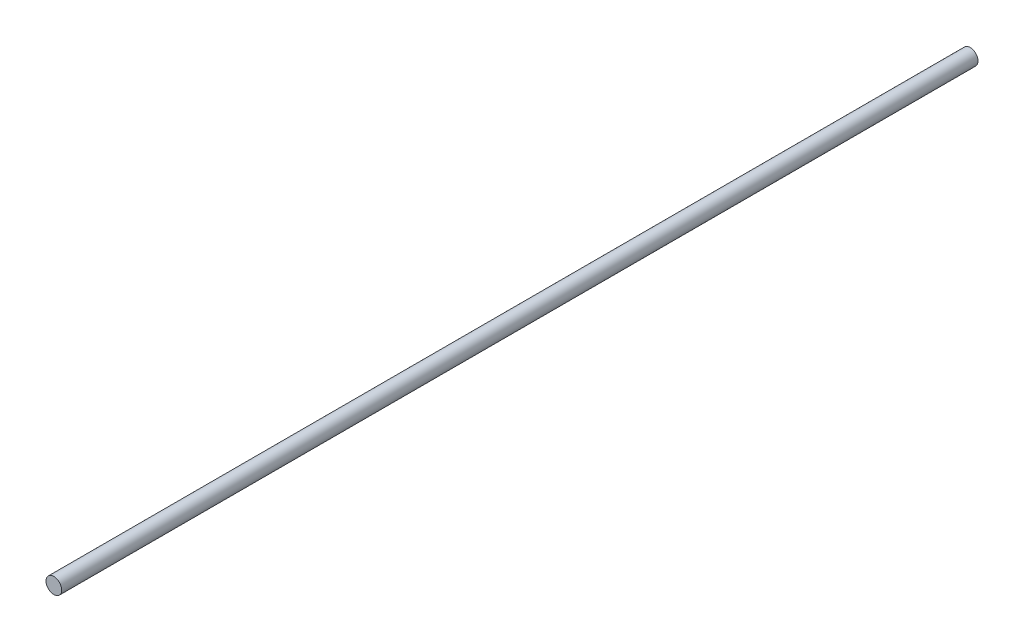
ISO-10303-21;
HEADER;
FILE_DESCRIPTION(('STEP AP214'),'2;1');
FILE_NAME('part.step','',(''),(''),'','','');
FILE_SCHEMA(('AUTOMOTIVE_DESIGN { 1 0 10303 214 1 1 1 1 }'));
ENDSEC;
DATA;
#1=APPLICATION_CONTEXT('core data for automotive mechanical design processes');
#2=APPLICATION_PROTOCOL_DEFINITION('international standard','automotive_design',2000,#1);
#3=PRODUCT_CONTEXT('',#1,'mechanical');
#4=PRODUCT('Part','Part','',(#3));
#5=PRODUCT_RELATED_PRODUCT_CATEGORY('part','',(#4));
#6=PRODUCT_DEFINITION_FORMATION('','',#4);
#7=PRODUCT_DEFINITION_CONTEXT('part definition',#1,'design');
#8=PRODUCT_DEFINITION('design','',#6,#7);
#9=PRODUCT_DEFINITION_SHAPE('','',#8);
#10=(LENGTH_UNIT() NAMED_UNIT(*) SI_UNIT(.MILLI.,.METRE.));
#11=(NAMED_UNIT(*) PLANE_ANGLE_UNIT() SI_UNIT($,.RADIAN.));
#12=(NAMED_UNIT(*) SI_UNIT($,.STERADIAN.) SOLID_ANGLE_UNIT());
#13=UNCERTAINTY_MEASURE_WITH_UNIT(LENGTH_MEASURE(1.E-05),#10,'distance_accuracy_value','');
#14=(GEOMETRIC_REPRESENTATION_CONTEXT(3) GLOBAL_UNCERTAINTY_ASSIGNED_CONTEXT((#13)) GLOBAL_UNIT_ASSIGNED_CONTEXT((#10,
#11,#12)) REPRESENTATION_CONTEXT('',''));
#15=CARTESIAN_POINT('',(0.,0.,0.));
#16=DIRECTION('',(0.,0.,1.));
#17=DIRECTION('',(1.,0.,0.));
#18=AXIS2_PLACEMENT_3D('',#15,#16,#17);
#19=CARTESIAN_POINT('',(0.,0.,370.84));
#20=DIRECTION('',(0.,0.,-1.));
#21=DIRECTION('',(-1.,0.,0.));
#22=AXIS2_PLACEMENT_3D('',#19,#20,#21);
#23=CYLINDRICAL_SURFACE('',#22,3.175);
#24=CARTESIAN_POINT('',(0.,0.,370.84));
#25=DIRECTION('',(0.,0.,1.));
#26=DIRECTION('',(1.,0.,0.));
#27=AXIS2_PLACEMENT_3D('',#24,#25,#26);
#28=CIRCLE('',#27,3.175);
#29=CARTESIAN_POINT('',(-3.175,0.,370.84));
#30=VERTEX_POINT('',#29);
#31=EDGE_CURVE('E10',#30,#30,#28,.T.);
#32=CARTESIAN_POINT('',(0.,0.,0.));
#33=DIRECTION('',(0.,0.,1.));
#34=DIRECTION('',(1.,0.,0.));
#35=AXIS2_PLACEMENT_3D('',#32,#33,#34);
#36=CIRCLE('',#35,3.175);
#37=CARTESIAN_POINT('',(-3.175,0.,0.));
#38=VERTEX_POINT('',#37);
#39=EDGE_CURVE('E40',#38,#38,#36,.T.);
#40=CARTESIAN_POINT('',(-3.175,0.,370.84));
#41=CARTESIAN_POINT('',(-3.175,0.,366.977083333333));
#42=CARTESIAN_POINT('',(-3.175,0.,363.114166666667));
#43=CARTESIAN_POINT('',(-3.175,0.,355.388333333333));
#44=CARTESIAN_POINT('',(-3.175,0.,351.525416666667));
#45=CARTESIAN_POINT('',(-3.175,0.,343.799583333333));
#46=CARTESIAN_POINT('',(-3.175,0.,339.936666666667));
#47=CARTESIAN_POINT('',(-3.175,0.,332.210833333333));
#48=CARTESIAN_POINT('',(-3.175,0.,328.347916666667));
#49=CARTESIAN_POINT('',(-3.175,0.,320.622083333333));
#50=CARTESIAN_POINT('',(-3.175,0.,316.759166666667));
#51=CARTESIAN_POINT('',(-3.175,0.,309.033333333333));
#52=CARTESIAN_POINT('',(-3.175,0.,305.170416666667));
#53=CARTESIAN_POINT('',(-3.175,0.,297.444583333333));
#54=CARTESIAN_POINT('',(-3.175,0.,293.581666666667));
#55=CARTESIAN_POINT('',(-3.175,0.,285.855833333333));
#56=CARTESIAN_POINT('',(-3.175,0.,281.992916666667));
#57=CARTESIAN_POINT('',(-3.175,0.,274.267083333333));
#58=CARTESIAN_POINT('',(-3.175,0.,270.404166666667));
#59=CARTESIAN_POINT('',(-3.175,0.,262.678333333333));
#60=CARTESIAN_POINT('',(-3.175,0.,258.815416666667));
#61=CARTESIAN_POINT('',(-3.175,0.,251.089583333333));
#62=CARTESIAN_POINT('',(-3.175,0.,247.226666666667));
#63=CARTESIAN_POINT('',(-3.175,0.,239.500833333333));
#64=CARTESIAN_POINT('',(-3.175,0.,235.637916666667));
#65=CARTESIAN_POINT('',(-3.175,0.,227.912083333333));
#66=CARTESIAN_POINT('',(-3.175,0.,224.049166666667));
#67=CARTESIAN_POINT('',(-3.175,0.,216.323333333333));
#68=CARTESIAN_POINT('',(-3.175,0.,212.460416666667));
#69=CARTESIAN_POINT('',(-3.175,0.,204.734583333333));
#70=CARTESIAN_POINT('',(-3.175,0.,200.871666666667));
#71=CARTESIAN_POINT('',(-3.175,0.,193.145833333333));
#72=CARTESIAN_POINT('',(-3.175,0.,189.282916666667));
#73=CARTESIAN_POINT('',(-3.175,0.,181.557083333333));
#74=CARTESIAN_POINT('',(-3.175,0.,177.694166666667));
#75=CARTESIAN_POINT('',(-3.175,0.,169.968333333333));
#76=CARTESIAN_POINT('',(-3.175,0.,166.105416666667));
#77=CARTESIAN_POINT('',(-3.175,0.,158.379583333333));
#78=CARTESIAN_POINT('',(-3.175,0.,154.516666666667));
#79=CARTESIAN_POINT('',(-3.175,0.,146.790833333333));
#80=CARTESIAN_POINT('',(-3.175,0.,142.927916666667));
#81=CARTESIAN_POINT('',(-3.175,0.,135.202083333333));
#82=CARTESIAN_POINT('',(-3.175,0.,131.339166666667));
#83=CARTESIAN_POINT('',(-3.175,0.,123.613333333333));
#84=CARTESIAN_POINT('',(-3.175,0.,119.750416666667));
#85=CARTESIAN_POINT('',(-3.175,0.,112.024583333333));
#86=CARTESIAN_POINT('',(-3.175,0.,108.161666666667));
#87=CARTESIAN_POINT('',(-3.175,0.,100.435833333333));
#88=CARTESIAN_POINT('',(-3.175,0.,96.5729166666667));
#89=CARTESIAN_POINT('',(-3.175,0.,88.8470833333333));
#90=CARTESIAN_POINT('',(-3.175,0.,84.9841666666667));
#91=CARTESIAN_POINT('',(-3.175,0.,77.2583333333333));
#92=CARTESIAN_POINT('',(-3.175,0.,73.3954166666667));
#93=CARTESIAN_POINT('',(-3.175,0.,65.6695833333333));
#94=CARTESIAN_POINT('',(-3.175,0.,61.8066666666667));
#95=CARTESIAN_POINT('',(-3.175,0.,54.0808333333333));
#96=CARTESIAN_POINT('',(-3.175,0.,50.2179166666667));
#97=CARTESIAN_POINT('',(-3.175,0.,42.4920833333333));
#98=CARTESIAN_POINT('',(-3.175,0.,38.6291666666667));
#99=CARTESIAN_POINT('',(-3.175,0.,30.9033333333333));
#100=CARTESIAN_POINT('',(-3.175,0.,27.0404166666667));
#101=CARTESIAN_POINT('',(-3.175,0.,19.3145833333333));
#102=CARTESIAN_POINT('',(-3.175,0.,15.4516666666667));
#103=CARTESIAN_POINT('',(-3.175,0.,7.72583333333332));
#104=CARTESIAN_POINT('',(-3.175,0.,3.86291666666666));
#105=CARTESIAN_POINT('',(-3.175,0.,0.));
#106=B_SPLINE_CURVE_WITH_KNOTS('',3,(#40,#41,#42,#43,#44,#45,#46,#47,#48,#49,#50,#51,#52,#53,
#54,#55,#56,#57,#58,#59,#60,#61,#62,#63,#64,#65,#66,#67,#68,#69,#70,#71,#72,#73,#74,#75,#76,#77,
#78,#79,#80,#81,#82,#83,#84,#85,#86,#87,#88,#89,#90,#91,#92,#93,#94,#95,#96,#97,#98,#99,#100,
#101,#102,#103,#104,#105),.UNSPECIFIED.,.F.,.F.,(4,2,2,2,2,2,2,2,2,2,2,2,2,2,2,2,2,2,2,2,2,2,2,
2,2,2,2,2,2,2,2,2,4),(0.,11.58875,23.1775,34.7662499999999,46.355,57.94375,69.5324999999999,
81.12125,92.71,104.29875,115.8875,127.47625,139.065,150.65375,162.2425,173.83125,185.42,
197.00875,208.5975,220.18625,231.775,243.36375,254.9525,266.54125,278.13,289.71875,301.3075,
312.89625,324.485,336.07375,347.6625,359.25125,370.84),.UNSPECIFIED.);
#107=EDGE_CURVE('BSEAM37',#30,#38,#106,.T.);
#108=ORIENTED_EDGE('',*,*,#31,.F.);
#109=ORIENTED_EDGE('',*,*,#39,.T.);
#110=ORIENTED_EDGE('',*,*,#107,.T.);
#111=ORIENTED_EDGE('',*,*,#107,.F.);
#112=EDGE_LOOP('',(#108,#110,#109,#111));
#113=FACE_BOUND('',#112,.T.);
#114=ADVANCED_FACE('F37',(#113),#23,.T.);
#115=CARTESIAN_POINT('',(0.,0.,370.84));
#116=DIRECTION('',(0.,0.,1.));
#117=DIRECTION('',(1.,0.,0.));
#118=AXIS2_PLACEMENT_3D('',#115,#116,#117);
#119=PLANE('',#118);
#120=ORIENTED_EDGE('',*,*,#31,.T.);
#121=EDGE_LOOP('',(#120));
#122=FACE_BOUND('',#121,.T.);
#123=ADVANCED_FACE('F54',(#122),#119,.T.);
#124=CARTESIAN_POINT('',(0.,0.,0.));
#125=DIRECTION('',(0.,0.,1.));
#126=DIRECTION('',(1.,0.,0.));
#127=AXIS2_PLACEMENT_3D('',#124,#125,#126);
#128=PLANE('',#127);
#129=ORIENTED_EDGE('',*,*,#39,.F.);
#130=EDGE_LOOP('',(#129));
#131=FACE_BOUND('',#130,.T.);
#132=ADVANCED_FACE('F52',(#131),#128,.F.);
#133=CLOSED_SHELL('',(#114,#123,#132));
#134=MANIFOLD_SOLID_BREP('B2',#133);
#135=ADVANCED_BREP_SHAPE_REPRESENTATION('',(#18,#134),#14);
#136=SHAPE_DEFINITION_REPRESENTATION(#9,#135);
ENDSEC;
END-ISO-10303-21;
